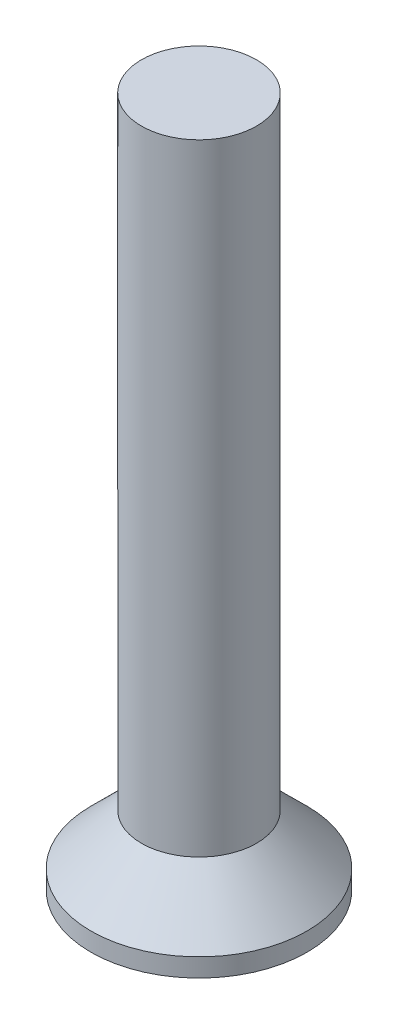
ISO-10303-21;
HEADER;
FILE_DESCRIPTION(('STEP AP214'),'2;1');
FILE_NAME('part.step','',(''),(''),'','','');
FILE_SCHEMA(('AUTOMOTIVE_DESIGN { 1 0 10303 214 1 1 1 1 }'));
ENDSEC;
DATA;
#1=APPLICATION_CONTEXT('core data for automotive mechanical design processes');
#2=APPLICATION_PROTOCOL_DEFINITION('international standard','automotive_design',2000,#1);
#3=PRODUCT_CONTEXT('',#1,'mechanical');
#4=PRODUCT('Part','Part','',(#3));
#5=PRODUCT_RELATED_PRODUCT_CATEGORY('part','',(#4));
#6=PRODUCT_DEFINITION_FORMATION('','',#4);
#7=PRODUCT_DEFINITION_CONTEXT('part definition',#1,'design');
#8=PRODUCT_DEFINITION('design','',#6,#7);
#9=PRODUCT_DEFINITION_SHAPE('','',#8);
#10=(LENGTH_UNIT() NAMED_UNIT(*) SI_UNIT(.MILLI.,.METRE.));
#11=(NAMED_UNIT(*) PLANE_ANGLE_UNIT() SI_UNIT($,.RADIAN.));
#12=(NAMED_UNIT(*) SI_UNIT($,.STERADIAN.) SOLID_ANGLE_UNIT());
#13=UNCERTAINTY_MEASURE_WITH_UNIT(LENGTH_MEASURE(1.E-05),#10,'distance_accuracy_value','');
#14=(GEOMETRIC_REPRESENTATION_CONTEXT(3) GLOBAL_UNCERTAINTY_ASSIGNED_CONTEXT((#13)) GLOBAL_UNIT_ASSIGNED_CONTEXT((#10,
#11,#12)) REPRESENTATION_CONTEXT('',''));
#15=CARTESIAN_POINT('',(0.,0.,0.));
#16=DIRECTION('',(0.,0.,1.));
#17=DIRECTION('',(1.,0.,0.));
#18=AXIS2_PLACEMENT_3D('',#15,#16,#17);
#19=CARTESIAN_POINT('',(0.,1.5,0.));
#20=DIRECTION('',(0.,-1.,0.));
#21=DIRECTION('',(0.,0.,-1.));
#22=AXIS2_PLACEMENT_3D('',#19,#20,#21);
#23=CYLINDRICAL_SURFACE('',#22,2.35);
#24=CARTESIAN_POINT('',(0.,0.399999999999997,0.));
#25=DIRECTION('',(0.,1.,0.));
#26=DIRECTION('',(0.,0.,1.));
#27=AXIS2_PLACEMENT_3D('',#24,#25,#26);
#28=CIRCLE('',#27,2.35);
#29=CARTESIAN_POINT('',(0.,0.399999999999997,2.35));
#30=VERTEX_POINT('',#29);
#31=EDGE_CURVE('E11',#30,#30,#28,.F.);
#32=ORIENTED_EDGE('',*,*,#31,.T.);
#33=EDGE_LOOP('',(#32));
#34=FACE_BOUND('',#33,.T.);
#35=CARTESIAN_POINT('',(0.,0.,0.));
#36=DIRECTION('',(0.,1.,0.));
#37=DIRECTION('',(0.,0.,1.));
#38=AXIS2_PLACEMENT_3D('',#35,#36,#37);
#39=CIRCLE('',#38,2.35);
#40=CARTESIAN_POINT('',(0.,0.,2.35));
#41=VERTEX_POINT('',#40);
#42=EDGE_CURVE('E213',#41,#41,#39,.T.);
#43=ORIENTED_EDGE('',*,*,#42,.T.);
#44=EDGE_LOOP('',(#43));
#45=FACE_BOUND('',#44,.T.);
#46=ADVANCED_FACE('F36',(#34,#45),#23,.T.);
#47=CARTESIAN_POINT('',(0.,0.,0.));
#48=DIRECTION('',(0.,1.,0.));
#49=DIRECTION('',(0.,0.,1.));
#50=AXIS2_PLACEMENT_3D('',#47,#48,#49);
#51=PLANE('',#50);
#52=DIRECTION('',(1.,0.,0.));
#53=VECTOR('',#52,1.);
#54=CARTESIAN_POINT('',(-1.5,0.,-0.25));
#55=LINE('',#54,#53);
#56=CARTESIAN_POINT('',(-1.5,0.,-0.25));
#57=VERTEX_POINT('',#56);
#58=CARTESIAN_POINT('',(-0.25,0.,-0.25));
#59=VERTEX_POINT('',#58);
#60=EDGE_CURVE('E162',#57,#59,#55,.T.);
#61=ORIENTED_EDGE('',*,*,#60,.F.);
#62=DIRECTION('',(0.,0.,-1.));
#63=VECTOR('',#62,1.);
#64=CARTESIAN_POINT('',(-1.5,0.,0.25));
#65=LINE('',#64,#63);
#66=CARTESIAN_POINT('',(-1.5,0.,0.25));
#67=VERTEX_POINT('',#66);
#68=EDGE_CURVE('E52',#67,#57,#65,.T.);
#69=ORIENTED_EDGE('',*,*,#68,.F.);
#70=DIRECTION('',(-1.,0.,0.));
#71=VECTOR('',#70,1.);
#72=CARTESIAN_POINT('',(-0.25,0.,0.25));
#73=LINE('',#72,#71);
#74=CARTESIAN_POINT('',(-0.25,0.,0.25));
#75=VERTEX_POINT('',#74);
#76=EDGE_CURVE('E189',#75,#67,#73,.T.);
#77=ORIENTED_EDGE('',*,*,#76,.F.);
#78=DIRECTION('',(0.,0.,-1.));
#79=VECTOR('',#78,1.);
#80=CARTESIAN_POINT('',(-0.25,0.,1.5));
#81=LINE('',#80,#79);
#82=CARTESIAN_POINT('',(-0.25,0.,1.5));
#83=VERTEX_POINT('',#82);
#84=EDGE_CURVE('E187',#83,#75,#81,.T.);
#85=ORIENTED_EDGE('',*,*,#84,.F.);
#86=DIRECTION('',(-1.,0.,0.));
#87=VECTOR('',#86,1.);
#88=CARTESIAN_POINT('',(-0.25,0.,1.5));
#89=LINE('',#88,#87);
#90=CARTESIAN_POINT('',(0.25,0.,1.5));
#91=VERTEX_POINT('',#90);
#92=EDGE_CURVE('E136',#91,#83,#89,.T.);
#93=ORIENTED_EDGE('',*,*,#92,.F.);
#94=DIRECTION('',(0.,0.,1.));
#95=VECTOR('',#94,1.);
#96=CARTESIAN_POINT('',(0.25,0.,0.25));
#97=LINE('',#96,#95);
#98=CARTESIAN_POINT('',(0.25,0.,0.25));
#99=VERTEX_POINT('',#98);
#100=EDGE_CURVE('E183',#99,#91,#97,.T.);
#101=ORIENTED_EDGE('',*,*,#100,.F.);
#102=DIRECTION('',(-1.,0.,0.));
#103=VECTOR('',#102,1.);
#104=CARTESIAN_POINT('',(1.5,0.,0.25));
#105=LINE('',#104,#103);
#106=CARTESIAN_POINT('',(1.5,0.,0.25));
#107=VERTEX_POINT('',#106);
#108=EDGE_CURVE('E180',#107,#99,#105,.T.);
#109=ORIENTED_EDGE('',*,*,#108,.F.);
#110=DIRECTION('',(0.,0.,1.));
#111=VECTOR('',#110,1.);
#112=CARTESIAN_POINT('',(1.5,0.,-0.25));
#113=LINE('',#112,#111);
#114=CARTESIAN_POINT('',(1.5,0.,-0.25));
#115=VERTEX_POINT('',#114);
#116=EDGE_CURVE('E177',#115,#107,#113,.T.);
#117=ORIENTED_EDGE('',*,*,#116,.F.);
#118=DIRECTION('',(1.,0.,0.));
#119=VECTOR('',#118,1.);
#120=CARTESIAN_POINT('',(0.25,0.,-0.25));
#121=LINE('',#120,#119);
#122=CARTESIAN_POINT('',(0.25,0.,-0.25));
#123=VERTEX_POINT('',#122);
#124=EDGE_CURVE('E174',#123,#115,#121,.T.);
#125=ORIENTED_EDGE('',*,*,#124,.F.);
#126=DIRECTION('',(0.,0.,1.));
#127=VECTOR('',#126,1.);
#128=CARTESIAN_POINT('',(0.25,0.,-1.5));
#129=LINE('',#128,#127);
#130=CARTESIAN_POINT('',(0.25,0.,-1.5));
#131=VERTEX_POINT('',#130);
#132=EDGE_CURVE('E171',#131,#123,#129,.T.);
#133=ORIENTED_EDGE('',*,*,#132,.F.);
#134=DIRECTION('',(1.,0.,0.));
#135=VECTOR('',#134,1.);
#136=CARTESIAN_POINT('',(-0.25,0.,-1.5));
#137=LINE('',#136,#135);
#138=CARTESIAN_POINT('',(-0.25,0.,-1.5));
#139=VERTEX_POINT('',#138);
#140=EDGE_CURVE('E168',#139,#131,#137,.T.);
#141=ORIENTED_EDGE('',*,*,#140,.F.);
#142=DIRECTION('',(0.,0.,-1.));
#143=VECTOR('',#142,1.);
#144=CARTESIAN_POINT('',(-0.25,0.,-0.25));
#145=LINE('',#144,#143);
#146=EDGE_CURVE('E165',#59,#139,#145,.T.);
#147=ORIENTED_EDGE('',*,*,#146,.F.);
#148=EDGE_LOOP('',(#61,#69,#77,#85,#93,#101,#109,#117,#125,#133,#141,#147));
#149=FACE_BOUND('',#148,.T.);
#150=ORIENTED_EDGE('',*,*,#42,.F.);
#151=EDGE_LOOP('',(#150));
#152=FACE_BOUND('',#151,.T.);
#153=ADVANCED_FACE('F219',(#149,#152),#51,.F.);
#154=CARTESIAN_POINT('',(0.,15.,0.));
#155=DIRECTION('',(0.,-1.,0.));
#156=DIRECTION('',(0.,0.,-1.));
#157=AXIS2_PLACEMENT_3D('',#154,#155,#156);
#158=CYLINDRICAL_SURFACE('',#157,1.25);
#159=CARTESIAN_POINT('',(0.,1.5,0.));
#160=DIRECTION('',(0.,1.,0.));
#161=DIRECTION('',(0.,0.,1.));
#162=AXIS2_PLACEMENT_3D('',#159,#160,#161);
#163=CIRCLE('',#162,1.25);
#164=CARTESIAN_POINT('',(0.,1.5,1.25));
#165=VERTEX_POINT('',#164);
#166=EDGE_CURVE('E45',#165,#165,#163,.T.);
#167=ORIENTED_EDGE('',*,*,#166,.T.);
#168=EDGE_LOOP('',(#167));
#169=FACE_BOUND('',#168,.T.);
#170=CARTESIAN_POINT('',(0.,15.,0.));
#171=DIRECTION('',(0.,-1.,0.));
#172=DIRECTION('',(0.,0.,-1.));
#173=AXIS2_PLACEMENT_3D('',#170,#171,#172);
#174=CIRCLE('',#173,1.25);
#175=CARTESIAN_POINT('',(0.,15.,-1.25));
#176=VERTEX_POINT('',#175);
#177=EDGE_CURVE('E193',#176,#176,#174,.T.);
#178=ORIENTED_EDGE('',*,*,#177,.T.);
#179=EDGE_LOOP('',(#178));
#180=FACE_BOUND('',#179,.T.);
#181=ADVANCED_FACE('F221',(#169,#180),#158,.T.);
#182=CARTESIAN_POINT('',(0.,15.,0.));
#183=DIRECTION('',(0.,-1.,0.));
#184=DIRECTION('',(0.,0.,-1.));
#185=AXIS2_PLACEMENT_3D('',#182,#183,#184);
#186=PLANE('',#185);
#187=ORIENTED_EDGE('',*,*,#177,.F.);
#188=EDGE_LOOP('',(#187));
#189=FACE_BOUND('',#188,.T.);
#190=ADVANCED_FACE('F228',(#189),#186,.F.);
#191=CARTESIAN_POINT('',(0.,1.5,0.));
#192=DIRECTION('',(0.,-1.,0.));
#193=DIRECTION('',(0.,0.,-1.));
#194=AXIS2_PLACEMENT_3D('',#191,#192,#193);
#195=CONICAL_SURFACE('',#194,1.25,0.785398163397447);
#196=ORIENTED_EDGE('',*,*,#31,.F.);
#197=EDGE_LOOP('',(#196));
#198=FACE_BOUND('',#197,.T.);
#199=ORIENTED_EDGE('',*,*,#166,.F.);
#200=EDGE_LOOP('',(#199));
#201=FACE_BOUND('',#200,.T.);
#202=ADVANCED_FACE('F39',(#198,#201),#195,.T.);
#203=CARTESIAN_POINT('',(-1.5,0.3,0.25));
#204=DIRECTION('',(-1.,0.,0.));
#205=DIRECTION('',(0.,0.,1.));
#206=AXIS2_PLACEMENT_3D('',#203,#204,#205);
#207=PLANE('',#206);
#208=ORIENTED_EDGE('',*,*,#68,.T.);
#209=DIRECTION('',(0.,-1.,0.));
#210=VECTOR('',#209,1.);
#211=CARTESIAN_POINT('',(-1.5,0.3,-0.25));
#212=LINE('',#211,#210);
#213=CARTESIAN_POINT('',(-1.5,0.3,-0.25));
#214=VERTEX_POINT('',#213);
#215=EDGE_CURVE('E100',#214,#57,#212,.T.);
#216=ORIENTED_EDGE('',*,*,#215,.F.);
#217=DIRECTION('',(0.,0.,-1.));
#218=VECTOR('',#217,1.);
#219=CARTESIAN_POINT('',(-1.5,0.3,0.25));
#220=LINE('',#219,#218);
#221=CARTESIAN_POINT('',(-1.5,0.3,0.25));
#222=VERTEX_POINT('',#221);
#223=EDGE_CURVE('E191',#222,#214,#220,.T.);
#224=ORIENTED_EDGE('',*,*,#223,.F.);
#225=DIRECTION('',(0.,-1.,0.));
#226=VECTOR('',#225,1.);
#227=CARTESIAN_POINT('',(-1.5,0.3,0.25));
#228=LINE('',#227,#226);
#229=EDGE_CURVE('E60',#222,#67,#228,.T.);
#230=ORIENTED_EDGE('',*,*,#229,.T.);
#231=EDGE_LOOP('',(#208,#216,#224,#230));
#232=FACE_BOUND('',#231,.T.);
#233=ADVANCED_FACE('F237',(#232),#207,.F.);
#234=CARTESIAN_POINT('',(-0.25,0.3,0.25));
#235=DIRECTION('',(0.,0.,1.));
#236=DIRECTION('',(1.,0.,0.));
#237=AXIS2_PLACEMENT_3D('',#234,#235,#236);
#238=PLANE('',#237);
#239=ORIENTED_EDGE('',*,*,#76,.T.);
#240=ORIENTED_EDGE('',*,*,#229,.F.);
#241=DIRECTION('',(-1.,0.,0.));
#242=VECTOR('',#241,1.);
#243=CARTESIAN_POINT('',(-0.25,0.3,0.25));
#244=LINE('',#243,#242);
#245=CARTESIAN_POINT('',(-0.25,0.3,0.25));
#246=VERTEX_POINT('',#245);
#247=EDGE_CURVE('E148',#246,#222,#244,.T.);
#248=ORIENTED_EDGE('',*,*,#247,.F.);
#249=DIRECTION('',(0.,-1.,0.));
#250=VECTOR('',#249,1.);
#251=CARTESIAN_POINT('',(-0.25,0.3,0.25));
#252=LINE('',#251,#250);
#253=EDGE_CURVE('E140',#246,#75,#252,.T.);
#254=ORIENTED_EDGE('',*,*,#253,.T.);
#255=EDGE_LOOP('',(#239,#240,#248,#254));
#256=FACE_BOUND('',#255,.T.);
#257=ADVANCED_FACE('F240',(#256),#238,.F.);
#258=CARTESIAN_POINT('',(-0.25,0.3,1.5));
#259=DIRECTION('',(-1.,0.,0.));
#260=DIRECTION('',(0.,0.,1.));
#261=AXIS2_PLACEMENT_3D('',#258,#259,#260);
#262=PLANE('',#261);
#263=ORIENTED_EDGE('',*,*,#84,.T.);
#264=ORIENTED_EDGE('',*,*,#253,.F.);
#265=DIRECTION('',(0.,0.,-1.));
#266=VECTOR('',#265,1.);
#267=CARTESIAN_POINT('',(-0.25,0.3,1.5));
#268=LINE('',#267,#266);
#269=CARTESIAN_POINT('',(-0.25,0.3,1.5));
#270=VERTEX_POINT('',#269);
#271=EDGE_CURVE('E144',#270,#246,#268,.T.);
#272=ORIENTED_EDGE('',*,*,#271,.F.);
#273=DIRECTION('',(0.,-1.,0.));
#274=VECTOR('',#273,1.);
#275=CARTESIAN_POINT('',(-0.25,0.3,1.5));
#276=LINE('',#275,#274);
#277=EDGE_CURVE('E129',#270,#83,#276,.T.);
#278=ORIENTED_EDGE('',*,*,#277,.T.);
#279=EDGE_LOOP('',(#263,#264,#272,#278));
#280=FACE_BOUND('',#279,.T.);
#281=ADVANCED_FACE('F145',(#280),#262,.F.);
#282=CARTESIAN_POINT('',(-0.25,0.3,1.5));
#283=DIRECTION('',(0.,0.,1.));
#284=DIRECTION('',(1.,0.,0.));
#285=AXIS2_PLACEMENT_3D('',#282,#283,#284);
#286=PLANE('',#285);
#287=ORIENTED_EDGE('',*,*,#92,.T.);
#288=ORIENTED_EDGE('',*,*,#277,.F.);
#289=DIRECTION('',(-1.,0.,0.));
#290=VECTOR('',#289,1.);
#291=CARTESIAN_POINT('',(-0.25,0.3,1.5));
#292=LINE('',#291,#290);
#293=CARTESIAN_POINT('',(0.25,0.3,1.5));
#294=VERTEX_POINT('',#293);
#295=EDGE_CURVE('E133',#294,#270,#292,.T.);
#296=ORIENTED_EDGE('',*,*,#295,.F.);
#297=DIRECTION('',(0.,-1.,0.));
#298=VECTOR('',#297,1.);
#299=CARTESIAN_POINT('',(0.25,0.3,1.5));
#300=LINE('',#299,#298);
#301=EDGE_CURVE('E141',#294,#91,#300,.T.);
#302=ORIENTED_EDGE('',*,*,#301,.T.);
#303=EDGE_LOOP('',(#287,#288,#296,#302));
#304=FACE_BOUND('',#303,.T.);
#305=ADVANCED_FACE('F131',(#304),#286,.F.);
#306=CARTESIAN_POINT('',(0.25,0.3,0.25));
#307=DIRECTION('',(1.,0.,0.));
#308=DIRECTION('',(0.,0.,-1.));
#309=AXIS2_PLACEMENT_3D('',#306,#307,#308);
#310=PLANE('',#309);
#311=ORIENTED_EDGE('',*,*,#100,.T.);
#312=ORIENTED_EDGE('',*,*,#301,.F.);
#313=DIRECTION('',(0.,0.,1.));
#314=VECTOR('',#313,1.);
#315=CARTESIAN_POINT('',(0.25,0.3,0.25));
#316=LINE('',#315,#314);
#317=CARTESIAN_POINT('',(0.25,0.3,0.25));
#318=VERTEX_POINT('',#317);
#319=EDGE_CURVE('E154',#318,#294,#316,.T.);
#320=ORIENTED_EDGE('',*,*,#319,.F.);
#321=DIRECTION('',(0.,-1.,0.));
#322=VECTOR('',#321,1.);
#323=CARTESIAN_POINT('',(0.25,0.3,0.25));
#324=LINE('',#323,#322);
#325=EDGE_CURVE('E196',#318,#99,#324,.T.);
#326=ORIENTED_EDGE('',*,*,#325,.T.);
#327=EDGE_LOOP('',(#311,#312,#320,#326));
#328=FACE_BOUND('',#327,.T.);
#329=ADVANCED_FACE('F268',(#328),#310,.F.);
#330=CARTESIAN_POINT('',(1.5,0.3,0.25));
#331=DIRECTION('',(0.,0.,1.));
#332=DIRECTION('',(1.,0.,0.));
#333=AXIS2_PLACEMENT_3D('',#330,#331,#332);
#334=PLANE('',#333);
#335=ORIENTED_EDGE('',*,*,#108,.T.);
#336=ORIENTED_EDGE('',*,*,#325,.F.);
#337=DIRECTION('',(-1.,0.,0.));
#338=VECTOR('',#337,1.);
#339=CARTESIAN_POINT('',(1.5,0.3,0.25));
#340=LINE('',#339,#338);
#341=CARTESIAN_POINT('',(1.5,0.3,0.25));
#342=VERTEX_POINT('',#341);
#343=EDGE_CURVE('E156',#342,#318,#340,.T.);
#344=ORIENTED_EDGE('',*,*,#343,.F.);
#345=DIRECTION('',(0.,-1.,0.));
#346=VECTOR('',#345,1.);
#347=CARTESIAN_POINT('',(1.5,0.3,0.25));
#348=LINE('',#347,#346);
#349=EDGE_CURVE('E198',#342,#107,#348,.T.);
#350=ORIENTED_EDGE('',*,*,#349,.T.);
#351=EDGE_LOOP('',(#335,#336,#344,#350));
#352=FACE_BOUND('',#351,.T.);
#353=ADVANCED_FACE('F264',(#352),#334,.F.);
#354=CARTESIAN_POINT('',(1.5,0.3,-0.25));
#355=DIRECTION('',(1.,0.,0.));
#356=DIRECTION('',(0.,0.,-1.));
#357=AXIS2_PLACEMENT_3D('',#354,#355,#356);
#358=PLANE('',#357);
#359=ORIENTED_EDGE('',*,*,#116,.T.);
#360=ORIENTED_EDGE('',*,*,#349,.F.);
#361=DIRECTION('',(0.,0.,1.));
#362=VECTOR('',#361,1.);
#363=CARTESIAN_POINT('',(1.5,0.3,-0.25));
#364=LINE('',#363,#362);
#365=CARTESIAN_POINT('',(1.5,0.3,-0.25));
#366=VERTEX_POINT('',#365);
#367=EDGE_CURVE('E414',#366,#342,#364,.T.);
#368=ORIENTED_EDGE('',*,*,#367,.F.);
#369=DIRECTION('',(0.,-1.,0.));
#370=VECTOR('',#369,1.);
#371=CARTESIAN_POINT('',(1.5,0.3,-0.25));
#372=LINE('',#371,#370);
#373=EDGE_CURVE('E200',#366,#115,#372,.T.);
#374=ORIENTED_EDGE('',*,*,#373,.T.);
#375=EDGE_LOOP('',(#359,#360,#368,#374));
#376=FACE_BOUND('',#375,.T.);
#377=ADVANCED_FACE('F260',(#376),#358,.F.);
#378=CARTESIAN_POINT('',(0.25,0.3,-0.25));
#379=DIRECTION('',(0.,0.,-1.));
#380=DIRECTION('',(-1.,0.,0.));
#381=AXIS2_PLACEMENT_3D('',#378,#379,#380);
#382=PLANE('',#381);
#383=ORIENTED_EDGE('',*,*,#124,.T.);
#384=ORIENTED_EDGE('',*,*,#373,.F.);
#385=DIRECTION('',(1.,0.,0.));
#386=VECTOR('',#385,1.);
#387=CARTESIAN_POINT('',(0.25,0.3,-0.25));
#388=LINE('',#387,#386);
#389=CARTESIAN_POINT('',(0.25,0.3,-0.25));
#390=VERTEX_POINT('',#389);
#391=EDGE_CURVE('E411',#390,#366,#388,.T.);
#392=ORIENTED_EDGE('',*,*,#391,.F.);
#393=DIRECTION('',(0.,-1.,0.));
#394=VECTOR('',#393,1.);
#395=CARTESIAN_POINT('',(0.25,0.3,-0.25));
#396=LINE('',#395,#394);
#397=EDGE_CURVE('E202',#390,#123,#396,.T.);
#398=ORIENTED_EDGE('',*,*,#397,.T.);
#399=EDGE_LOOP('',(#383,#384,#392,#398));
#400=FACE_BOUND('',#399,.T.);
#401=ADVANCED_FACE('F256',(#400),#382,.F.);
#402=CARTESIAN_POINT('',(0.25,0.3,-1.5));
#403=DIRECTION('',(1.,0.,0.));
#404=DIRECTION('',(0.,0.,-1.));
#405=AXIS2_PLACEMENT_3D('',#402,#403,#404);
#406=PLANE('',#405);
#407=ORIENTED_EDGE('',*,*,#132,.T.);
#408=ORIENTED_EDGE('',*,*,#397,.F.);
#409=DIRECTION('',(0.,0.,1.));
#410=VECTOR('',#409,1.);
#411=CARTESIAN_POINT('',(0.25,0.3,-1.5));
#412=LINE('',#411,#410);
#413=CARTESIAN_POINT('',(0.25,0.3,-1.5));
#414=VERTEX_POINT('',#413);
#415=EDGE_CURVE('E408',#414,#390,#412,.T.);
#416=ORIENTED_EDGE('',*,*,#415,.F.);
#417=DIRECTION('',(0.,-1.,0.));
#418=VECTOR('',#417,1.);
#419=CARTESIAN_POINT('',(0.25,0.3,-1.5));
#420=LINE('',#419,#418);
#421=EDGE_CURVE('E204',#414,#131,#420,.T.);
#422=ORIENTED_EDGE('',*,*,#421,.T.);
#423=EDGE_LOOP('',(#407,#408,#416,#422));
#424=FACE_BOUND('',#423,.T.);
#425=ADVANCED_FACE('F252',(#424),#406,.F.);
#426=CARTESIAN_POINT('',(-0.25,0.3,-1.5));
#427=DIRECTION('',(0.,0.,-1.));
#428=DIRECTION('',(-1.,0.,0.));
#429=AXIS2_PLACEMENT_3D('',#426,#427,#428);
#430=PLANE('',#429);
#431=ORIENTED_EDGE('',*,*,#140,.T.);
#432=ORIENTED_EDGE('',*,*,#421,.F.);
#433=DIRECTION('',(1.,0.,0.));
#434=VECTOR('',#433,1.);
#435=CARTESIAN_POINT('',(-0.25,0.3,-1.5));
#436=LINE('',#435,#434);
#437=CARTESIAN_POINT('',(-0.25,0.3,-1.5));
#438=VERTEX_POINT('',#437);
#439=EDGE_CURVE('E405',#438,#414,#436,.T.);
#440=ORIENTED_EDGE('',*,*,#439,.F.);
#441=DIRECTION('',(0.,-1.,0.));
#442=VECTOR('',#441,1.);
#443=CARTESIAN_POINT('',(-0.25,0.3,-1.5));
#444=LINE('',#443,#442);
#445=EDGE_CURVE('E206',#438,#139,#444,.T.);
#446=ORIENTED_EDGE('',*,*,#445,.T.);
#447=EDGE_LOOP('',(#431,#432,#440,#446));
#448=FACE_BOUND('',#447,.T.);
#449=ADVANCED_FACE('F248',(#448),#430,.F.);
#450=CARTESIAN_POINT('',(-0.25,0.3,-0.25));
#451=DIRECTION('',(-1.,0.,0.));
#452=DIRECTION('',(0.,0.,1.));
#453=AXIS2_PLACEMENT_3D('',#450,#451,#452);
#454=PLANE('',#453);
#455=ORIENTED_EDGE('',*,*,#146,.T.);
#456=ORIENTED_EDGE('',*,*,#445,.F.);
#457=DIRECTION('',(0.,0.,-1.));
#458=VECTOR('',#457,1.);
#459=CARTESIAN_POINT('',(-0.25,0.3,-0.25));
#460=LINE('',#459,#458);
#461=CARTESIAN_POINT('',(-0.25,0.3,-0.25));
#462=VERTEX_POINT('',#461);
#463=EDGE_CURVE('E400',#462,#438,#460,.T.);
#464=ORIENTED_EDGE('',*,*,#463,.F.);
#465=DIRECTION('',(0.,-1.,0.));
#466=VECTOR('',#465,1.);
#467=CARTESIAN_POINT('',(-0.25,0.3,-0.25));
#468=LINE('',#467,#466);
#469=EDGE_CURVE('E208',#462,#59,#468,.T.);
#470=ORIENTED_EDGE('',*,*,#469,.T.);
#471=EDGE_LOOP('',(#455,#456,#464,#470));
#472=FACE_BOUND('',#471,.T.);
#473=ADVANCED_FACE('F244',(#472),#454,.F.);
#474=CARTESIAN_POINT('',(-1.5,0.3,-0.25));
#475=DIRECTION('',(0.,0.,-1.));
#476=DIRECTION('',(-1.,0.,0.));
#477=AXIS2_PLACEMENT_3D('',#474,#475,#476);
#478=PLANE('',#477);
#479=ORIENTED_EDGE('',*,*,#60,.T.);
#480=ORIENTED_EDGE('',*,*,#469,.F.);
#481=DIRECTION('',(1.,0.,0.));
#482=VECTOR('',#481,1.);
#483=CARTESIAN_POINT('',(-1.5,0.3,-0.25));
#484=LINE('',#483,#482);
#485=EDGE_CURVE('E398',#214,#462,#484,.T.);
#486=ORIENTED_EDGE('',*,*,#485,.F.);
#487=ORIENTED_EDGE('',*,*,#215,.T.);
#488=EDGE_LOOP('',(#479,#480,#486,#487));
#489=FACE_BOUND('',#488,.T.);
#490=ADVANCED_FACE('F241',(#489),#478,.F.);
#491=CARTESIAN_POINT('',(0.,0.3,0.));
#492=DIRECTION('',(0.,-1.,0.));
#493=DIRECTION('',(0.,0.,-1.));
#494=AXIS2_PLACEMENT_3D('',#491,#492,#493);
#495=PLANE('',#494);
#496=ORIENTED_EDGE('',*,*,#223,.T.);
#497=ORIENTED_EDGE('',*,*,#485,.T.);
#498=ORIENTED_EDGE('',*,*,#463,.T.);
#499=ORIENTED_EDGE('',*,*,#439,.T.);
#500=ORIENTED_EDGE('',*,*,#415,.T.);
#501=ORIENTED_EDGE('',*,*,#391,.T.);
#502=ORIENTED_EDGE('',*,*,#367,.T.);
#503=ORIENTED_EDGE('',*,*,#343,.T.);
#504=ORIENTED_EDGE('',*,*,#319,.T.);
#505=ORIENTED_EDGE('',*,*,#295,.T.);
#506=ORIENTED_EDGE('',*,*,#271,.T.);
#507=ORIENTED_EDGE('',*,*,#247,.T.);
#508=EDGE_LOOP('',(#496,#497,#498,#499,#500,#501,#502,#503,#504,#505,#506,#507));
#509=FACE_BOUND('',#508,.T.);
#510=ADVANCED_FACE('F151',(#509),#495,.T.);
#511=CLOSED_SHELL('',(#46,#153,#181,#190,#202,#233,#257,#281,#305,#329,#353,#377,#401,#425,#449,
#473,#490,#510));
#512=MANIFOLD_SOLID_BREP('B2',#511);
#513=ADVANCED_BREP_SHAPE_REPRESENTATION('',(#18,#512),#14);
#514=SHAPE_DEFINITION_REPRESENTATION(#9,#513);
ENDSEC;
END-ISO-10303-21;
